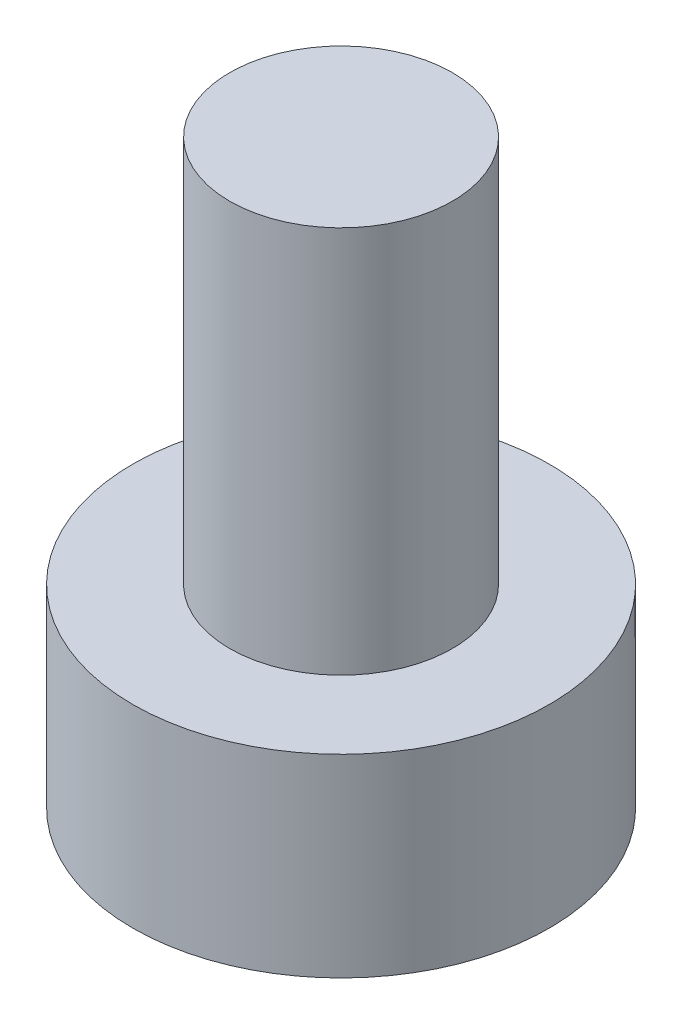
ISO-10303-21;
HEADER;
FILE_DESCRIPTION(('STEP AP214'),'2;1');
FILE_NAME('part.step','',(''),(''),'','','');
FILE_SCHEMA(('AUTOMOTIVE_DESIGN { 1 0 10303 214 1 1 1 1 }'));
ENDSEC;
DATA;
#1=APPLICATION_CONTEXT('core data for automotive mechanical design processes');
#2=APPLICATION_PROTOCOL_DEFINITION('international standard','automotive_design',2000,#1);
#3=PRODUCT_CONTEXT('',#1,'mechanical');
#4=PRODUCT('Part','Part','',(#3));
#5=PRODUCT_RELATED_PRODUCT_CATEGORY('part','',(#4));
#6=PRODUCT_DEFINITION_FORMATION('','',#4);
#7=PRODUCT_DEFINITION_CONTEXT('part definition',#1,'design');
#8=PRODUCT_DEFINITION('design','',#6,#7);
#9=PRODUCT_DEFINITION_SHAPE('','',#8);
#10=(LENGTH_UNIT() NAMED_UNIT(*) SI_UNIT(.MILLI.,.METRE.));
#11=(NAMED_UNIT(*) PLANE_ANGLE_UNIT() SI_UNIT($,.RADIAN.));
#12=(NAMED_UNIT(*) SI_UNIT($,.STERADIAN.) SOLID_ANGLE_UNIT());
#13=UNCERTAINTY_MEASURE_WITH_UNIT(LENGTH_MEASURE(1.E-05),#10,'distance_accuracy_value','');
#14=(GEOMETRIC_REPRESENTATION_CONTEXT(3) GLOBAL_UNCERTAINTY_ASSIGNED_CONTEXT((#13)) GLOBAL_UNIT_ASSIGNED_CONTEXT((#10,
#11,#12)) REPRESENTATION_CONTEXT('',''));
#15=CARTESIAN_POINT('',(0.,0.,0.));
#16=DIRECTION('',(0.,0.,1.));
#17=DIRECTION('',(1.,0.,0.));
#18=AXIS2_PLACEMENT_3D('',#15,#16,#17);
#19=CARTESIAN_POINT('',(0.,2.,0.));
#20=DIRECTION('',(0.,-1.,0.));
#21=DIRECTION('',(0.,0.,-1.));
#22=AXIS2_PLACEMENT_3D('',#19,#20,#21);
#23=CYLINDRICAL_SURFACE('',#22,2.15);
#24=CARTESIAN_POINT('',(0.,2.,0.));
#25=DIRECTION('',(0.,1.,0.));
#26=DIRECTION('',(0.,0.,1.));
#27=AXIS2_PLACEMENT_3D('',#24,#25,#26);
#28=CIRCLE('',#27,2.15);
#29=CARTESIAN_POINT('',(0.,2.,2.15));
#30=VERTEX_POINT('',#29);
#31=EDGE_CURVE('E45',#30,#30,#28,.T.);
#32=ORIENTED_EDGE('',*,*,#31,.F.);
#33=EDGE_LOOP('',(#32));
#34=FACE_BOUND('',#33,.T.);
#35=CARTESIAN_POINT('',(0.,0.,0.));
#36=DIRECTION('',(0.,1.,0.));
#37=DIRECTION('',(0.,0.,1.));
#38=AXIS2_PLACEMENT_3D('',#35,#36,#37);
#39=CIRCLE('',#38,2.15);
#40=CARTESIAN_POINT('',(0.,0.,2.15));
#41=VERTEX_POINT('',#40);
#42=EDGE_CURVE('E40',#41,#41,#39,.T.);
#43=ORIENTED_EDGE('',*,*,#42,.T.);
#44=EDGE_LOOP('',(#43));
#45=FACE_BOUND('',#44,.T.);
#46=ADVANCED_FACE('F37',(#34,#45),#23,.T.);
#47=CARTESIAN_POINT('',(0.,2.,0.));
#48=DIRECTION('',(0.,1.,0.));
#49=DIRECTION('',(0.,0.,1.));
#50=AXIS2_PLACEMENT_3D('',#47,#48,#49);
#51=PLANE('',#50);
#52=CARTESIAN_POINT('',(0.,2.,0.));
#53=DIRECTION('',(0.,1.,0.));
#54=DIRECTION('',(0.,0.,1.));
#55=AXIS2_PLACEMENT_3D('',#52,#53,#54);
#56=CIRCLE('',#55,1.15);
#57=CARTESIAN_POINT('',(0.,2.,1.15));
#58=VERTEX_POINT('',#57);
#59=EDGE_CURVE('E10',#58,#58,#56,.T.);
#60=ORIENTED_EDGE('',*,*,#59,.F.);
#61=EDGE_LOOP('',(#60));
#62=FACE_BOUND('',#61,.T.);
#63=ORIENTED_EDGE('',*,*,#31,.T.);
#64=EDGE_LOOP('',(#63));
#65=FACE_BOUND('',#64,.T.);
#66=ADVANCED_FACE('F65',(#62,#65),#51,.T.);
#67=CARTESIAN_POINT('',(0.,0.,0.));
#68=DIRECTION('',(0.,1.,0.));
#69=DIRECTION('',(0.,0.,1.));
#70=AXIS2_PLACEMENT_3D('',#67,#68,#69);
#71=PLANE('',#70);
#72=ORIENTED_EDGE('',*,*,#42,.F.);
#73=EDGE_LOOP('',(#72));
#74=FACE_BOUND('',#73,.T.);
#75=ADVANCED_FACE('F62',(#74),#71,.F.);
#76=CARTESIAN_POINT('',(0.,6.,0.));
#77=DIRECTION('',(0.,-1.,0.));
#78=DIRECTION('',(0.,0.,-1.));
#79=AXIS2_PLACEMENT_3D('',#76,#77,#78);
#80=CYLINDRICAL_SURFACE('',#79,1.15);
#81=CARTESIAN_POINT('',(0.,6.,0.));
#82=DIRECTION('',(0.,1.,0.));
#83=DIRECTION('',(0.,0.,1.));
#84=AXIS2_PLACEMENT_3D('',#81,#82,#83);
#85=CIRCLE('',#84,1.15);
#86=CARTESIAN_POINT('',(0.,6.,1.15));
#87=VERTEX_POINT('',#86);
#88=EDGE_CURVE('E52',#87,#87,#85,.T.);
#89=ORIENTED_EDGE('',*,*,#88,.F.);
#90=EDGE_LOOP('',(#89));
#91=FACE_BOUND('',#90,.T.);
#92=ORIENTED_EDGE('',*,*,#59,.T.);
#93=EDGE_LOOP('',(#92));
#94=FACE_BOUND('',#93,.T.);
#95=ADVANCED_FACE('F64',(#91,#94),#80,.T.);
#96=CARTESIAN_POINT('',(0.,6.,0.));
#97=DIRECTION('',(0.,1.,0.));
#98=DIRECTION('',(0.,0.,1.));
#99=AXIS2_PLACEMENT_3D('',#96,#97,#98);
#100=PLANE('',#99);
#101=ORIENTED_EDGE('',*,*,#88,.T.);
#102=EDGE_LOOP('',(#101));
#103=FACE_BOUND('',#102,.T.);
#104=ADVANCED_FACE('F70',(#103),#100,.T.);
#105=CLOSED_SHELL('',(#46,#66,#75,#95,#104));
#106=MANIFOLD_SOLID_BREP('B2',#105);
#107=ADVANCED_BREP_SHAPE_REPRESENTATION('',(#18,#106),#14);
#108=SHAPE_DEFINITION_REPRESENTATION(#9,#107);
ENDSEC;
END-ISO-10303-21;
